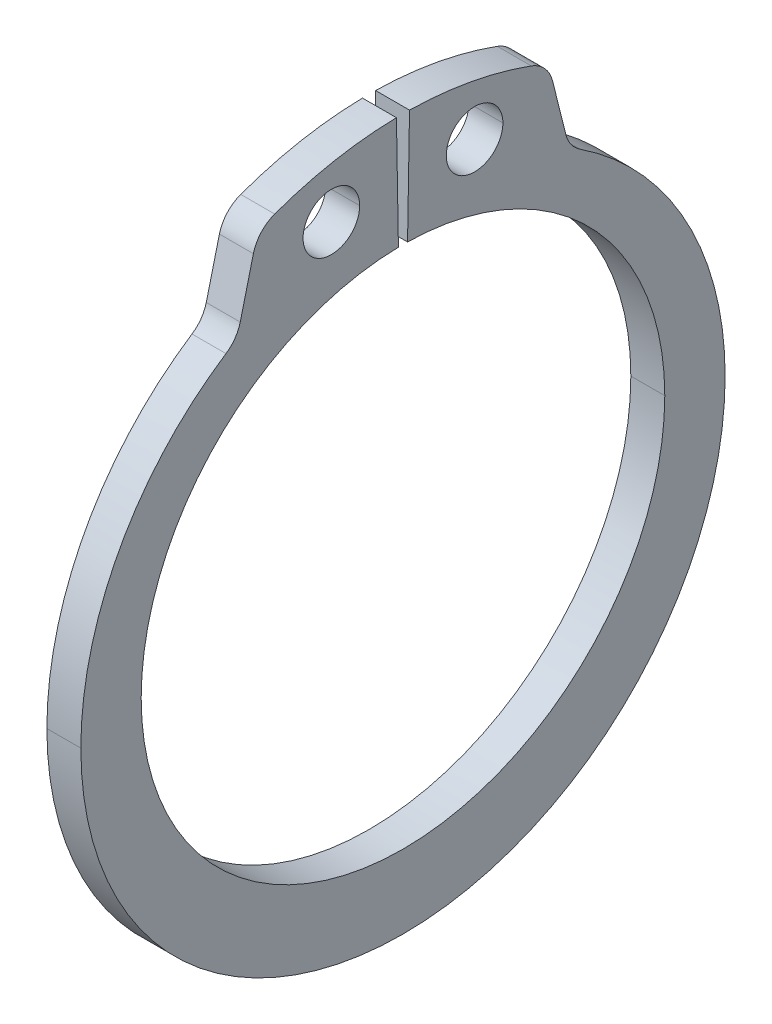
ISO-10303-21;
HEADER;
FILE_DESCRIPTION(('STEP AP214'),'2;1');
FILE_NAME('part.step','',(''),(''),'','','');
FILE_SCHEMA(('AUTOMOTIVE_DESIGN { 1 0 10303 214 1 1 1 1 }'));
ENDSEC;
DATA;
#1=APPLICATION_CONTEXT('core data for automotive mechanical design processes');
#2=APPLICATION_PROTOCOL_DEFINITION('international standard','automotive_design',2000,#1);
#3=PRODUCT_CONTEXT('',#1,'mechanical');
#4=PRODUCT('Part','Part','',(#3));
#5=PRODUCT_RELATED_PRODUCT_CATEGORY('part','',(#4));
#6=PRODUCT_DEFINITION_FORMATION('','',#4);
#7=PRODUCT_DEFINITION_CONTEXT('part definition',#1,'design');
#8=PRODUCT_DEFINITION('design','',#6,#7);
#9=PRODUCT_DEFINITION_SHAPE('','',#8);
#10=(LENGTH_UNIT() NAMED_UNIT(*) SI_UNIT(.MILLI.,.METRE.));
#11=(NAMED_UNIT(*) PLANE_ANGLE_UNIT() SI_UNIT($,.RADIAN.));
#12=(NAMED_UNIT(*) SI_UNIT($,.STERADIAN.) SOLID_ANGLE_UNIT());
#13=UNCERTAINTY_MEASURE_WITH_UNIT(LENGTH_MEASURE(1.E-05),#10,'distance_accuracy_value','');
#14=(GEOMETRIC_REPRESENTATION_CONTEXT(3) GLOBAL_UNCERTAINTY_ASSIGNED_CONTEXT((#13)) GLOBAL_UNIT_ASSIGNED_CONTEXT((#10,
#11,#12)) REPRESENTATION_CONTEXT('',''));
#15=CARTESIAN_POINT('',(0.,0.,0.));
#16=DIRECTION('',(0.,0.,1.));
#17=DIRECTION('',(1.,0.,0.));
#18=AXIS2_PLACEMENT_3D('',#15,#16,#17);
#19=CARTESIAN_POINT('',(0.6,10.0435846721276,-6.91422525299489));
#20=DIRECTION('',(-1.,0.,0.));
#21=DIRECTION('',(0.,0.,1.));
#22=AXIS2_PLACEMENT_3D('',#19,#20,#21);
#23=CYLINDRICAL_SURFACE('',#22,1.2);
#24=CARTESIAN_POINT('',(0.6,10.0435846721276,-6.91422525299489));
#25=DIRECTION('',(-1.,0.,0.));
#26=DIRECTION('',(0.,0.,-1.));
#27=AXIS2_PLACEMENT_3D('',#24,#25,#26);
#28=CIRCLE('',#27,1.2);
#29=CARTESIAN_POINT('',(0.6,9.04102340024933,-6.25477783573576));
#30=VERTEX_POINT('',#29);
#31=CARTESIAN_POINT('',(0.6,9.75327839740805,-5.74987038146369));
#32=VERTEX_POINT('',#31);
#33=EDGE_CURVE('E224',#30,#32,#28,.T.);
#34=ORIENTED_EDGE('',*,*,#33,.F.);
#35=DIRECTION('',(1.,0.,0.));
#36=VECTOR('',#35,1.);
#37=CARTESIAN_POINT('',(0.6,9.04102340024933,-6.25477783573576));
#38=LINE('',#37,#36);
#39=CARTESIAN_POINT('',(-0.6,9.04102340024933,-6.25477783573576));
#40=VERTEX_POINT('',#39);
#41=EDGE_CURVE('E226',#40,#30,#38,.T.);
#42=ORIENTED_EDGE('',*,*,#41,.F.);
#43=CARTESIAN_POINT('',(-0.6,10.0435846721276,-6.91422525299489));
#44=DIRECTION('',(1.,0.,0.));
#45=DIRECTION('',(0.,0.,-1.));
#46=AXIS2_PLACEMENT_3D('',#43,#44,#45);
#47=CIRCLE('',#46,1.2);
#48=CARTESIAN_POINT('',(-0.6,9.75327839740805,-5.74987038146369));
#49=VERTEX_POINT('',#48);
#50=EDGE_CURVE('E247',#49,#40,#47,.T.);
#51=ORIENTED_EDGE('',*,*,#50,.F.);
#52=DIRECTION('',(-1.,0.,0.));
#53=VECTOR('',#52,1.);
#54=CARTESIAN_POINT('',(-0.6,9.75327839740805,-5.74987038146369));
#55=LINE('',#54,#53);
#56=EDGE_CURVE('E254',#32,#49,#55,.T.);
#57=ORIENTED_EDGE('',*,*,#56,.F.);
#58=EDGE_LOOP('',(#34,#42,#51,#57));
#59=FACE_BOUND('',#58,.T.);
#60=ADVANCED_FACE('F16',(#59),#23,.F.);
#61=CARTESIAN_POINT('',(0.6,11.3231592010464,-4.12171878077083));
#62=DIRECTION('',(-1.,0.,0.));
#63=DIRECTION('',(0.,0.,1.));
#64=AXIS2_PLACEMENT_3D('',#61,#62,#63);
#65=CYLINDRICAL_SURFACE('',#64,1.2);
#66=CARTESIAN_POINT('',(0.6,11.3231592010464,-4.12171878077083));
#67=DIRECTION('',(1.,0.,0.));
#68=DIRECTION('',(0.,0.,-1.));
#69=AXIS2_PLACEMENT_3D('',#66,#67,#68);
#70=CIRCLE('',#69,1.2);
#71=CARTESIAN_POINT('',(0.6,11.613465475766,-5.28607365230203));
#72=VERTEX_POINT('',#71);
#73=CARTESIAN_POINT('',(0.6,12.4507767148435,-4.53218040209241));
#74=VERTEX_POINT('',#73);
#75=EDGE_CURVE('E259',#72,#74,#70,.T.);
#76=ORIENTED_EDGE('',*,*,#75,.F.);
#77=DIRECTION('',(1.,0.,0.));
#78=VECTOR('',#77,1.);
#79=CARTESIAN_POINT('',(0.6,11.613465475766,-5.28607365230203));
#80=LINE('',#79,#78);
#81=CARTESIAN_POINT('',(-0.6,11.613465475766,-5.28607365230203));
#82=VERTEX_POINT('',#81);
#83=EDGE_CURVE('E304',#82,#72,#80,.T.);
#84=ORIENTED_EDGE('',*,*,#83,.F.);
#85=CARTESIAN_POINT('',(-0.6,11.3231592010464,-4.12171878077083));
#86=DIRECTION('',(-1.,0.,0.));
#87=DIRECTION('',(0.,0.,-1.));
#88=AXIS2_PLACEMENT_3D('',#85,#86,#87);
#89=CIRCLE('',#88,1.2);
#90=CARTESIAN_POINT('',(-0.6,12.4507767148435,-4.53218040209241));
#91=VERTEX_POINT('',#90);
#92=EDGE_CURVE('E219',#91,#82,#89,.T.);
#93=ORIENTED_EDGE('',*,*,#92,.F.);
#94=DIRECTION('',(-1.,0.,0.));
#95=VECTOR('',#94,1.);
#96=CARTESIAN_POINT('',(0.6,12.4507767148435,-4.53218040209241));
#97=LINE('',#96,#95);
#98=EDGE_CURVE('E27',#74,#91,#97,.T.);
#99=ORIENTED_EDGE('',*,*,#98,.F.);
#100=EDGE_LOOP('',(#76,#84,#93,#99));
#101=FACE_BOUND('',#100,.T.);
#102=ADVANCED_FACE('F629',(#101),#65,.T.);
#103=CARTESIAN_POINT('',(0.6,11.3231592010464,4.12171878077083));
#104=DIRECTION('',(-1.,0.,0.));
#105=DIRECTION('',(0.,0.,1.));
#106=AXIS2_PLACEMENT_3D('',#103,#104,#105);
#107=CYLINDRICAL_SURFACE('',#106,1.2);
#108=CARTESIAN_POINT('',(0.6,11.3231592010464,4.12171878077083));
#109=DIRECTION('',(1.,0.,0.));
#110=DIRECTION('',(0.,0.,-1.));
#111=AXIS2_PLACEMENT_3D('',#108,#109,#110);
#112=CIRCLE('',#111,1.2);
#113=CARTESIAN_POINT('',(0.6,12.4507767148435,4.5321804020924));
#114=VERTEX_POINT('',#113);
#115=CARTESIAN_POINT('',(0.6,11.613465475766,5.28607365230202));
#116=VERTEX_POINT('',#115);
#117=EDGE_CURVE('E296',#114,#116,#112,.T.);
#118=ORIENTED_EDGE('',*,*,#117,.F.);
#119=DIRECTION('',(1.,0.,0.));
#120=VECTOR('',#119,1.);
#121=CARTESIAN_POINT('',(0.6,12.4507767148435,4.5321804020924));
#122=LINE('',#121,#120);
#123=CARTESIAN_POINT('',(-0.6,12.4507767148435,4.5321804020924));
#124=VERTEX_POINT('',#123);
#125=EDGE_CURVE('E310',#124,#114,#122,.T.);
#126=ORIENTED_EDGE('',*,*,#125,.F.);
#127=CARTESIAN_POINT('',(-0.6,11.3231592010464,4.12171878077083));
#128=DIRECTION('',(-1.,0.,0.));
#129=DIRECTION('',(0.,0.,-1.));
#130=AXIS2_PLACEMENT_3D('',#127,#128,#129);
#131=CIRCLE('',#130,1.2);
#132=CARTESIAN_POINT('',(-0.6,11.613465475766,5.28607365230202));
#133=VERTEX_POINT('',#132);
#134=EDGE_CURVE('E209',#133,#124,#131,.T.);
#135=ORIENTED_EDGE('',*,*,#134,.F.);
#136=DIRECTION('',(-1.,0.,0.));
#137=VECTOR('',#136,1.);
#138=CARTESIAN_POINT('',(0.6,11.613465475766,5.28607365230202));
#139=LINE('',#138,#137);
#140=EDGE_CURVE('E309',#116,#133,#139,.T.);
#141=ORIENTED_EDGE('',*,*,#140,.F.);
#142=EDGE_LOOP('',(#118,#126,#135,#141));
#143=FACE_BOUND('',#142,.T.);
#144=ADVANCED_FACE('F18',(#143),#107,.T.);
#145=CARTESIAN_POINT('',(0.6,10.0435846721276,6.91422525299489));
#146=DIRECTION('',(-1.,0.,0.));
#147=DIRECTION('',(0.,0.,1.));
#148=AXIS2_PLACEMENT_3D('',#145,#146,#147);
#149=CYLINDRICAL_SURFACE('',#148,1.2);
#150=CARTESIAN_POINT('',(0.6,10.0435846721276,6.91422525299489));
#151=DIRECTION('',(-1.,0.,0.));
#152=DIRECTION('',(0.,0.,-1.));
#153=AXIS2_PLACEMENT_3D('',#150,#151,#152);
#154=CIRCLE('',#153,1.2);
#155=CARTESIAN_POINT('',(0.6,9.75327839740805,5.74987038146369));
#156=VERTEX_POINT('',#155);
#157=CARTESIAN_POINT('',(0.6,9.04102340024933,6.25477783573576));
#158=VERTEX_POINT('',#157);
#159=EDGE_CURVE('E225',#156,#158,#154,.T.);
#160=ORIENTED_EDGE('',*,*,#159,.F.);
#161=DIRECTION('',(1.,0.,0.));
#162=VECTOR('',#161,1.);
#163=CARTESIAN_POINT('',(0.6,9.75327839740805,5.74987038146369));
#164=LINE('',#163,#162);
#165=CARTESIAN_POINT('',(-0.6,9.75327839740805,5.74987038146369));
#166=VERTEX_POINT('',#165);
#167=EDGE_CURVE('E305',#166,#156,#164,.T.);
#168=ORIENTED_EDGE('',*,*,#167,.F.);
#169=CARTESIAN_POINT('',(-0.6,10.0435846721276,6.91422525299489));
#170=DIRECTION('',(1.,0.,0.));
#171=DIRECTION('',(0.,0.,-1.));
#172=AXIS2_PLACEMENT_3D('',#169,#170,#171);
#173=CIRCLE('',#172,1.2);
#174=CARTESIAN_POINT('',(-0.6,9.04102340024933,6.25477783573576));
#175=VERTEX_POINT('',#174);
#176=EDGE_CURVE('E242',#175,#166,#173,.T.);
#177=ORIENTED_EDGE('',*,*,#176,.F.);
#178=DIRECTION('',(-1.,0.,0.));
#179=VECTOR('',#178,1.);
#180=CARTESIAN_POINT('',(0.6,9.04102340024933,6.25477783573576));
#181=LINE('',#180,#179);
#182=EDGE_CURVE('E42',#158,#175,#181,.T.);
#183=ORIENTED_EDGE('',*,*,#182,.F.);
#184=EDGE_LOOP('',(#160,#168,#177,#183));
#185=FACE_BOUND('',#184,.T.);
#186=ADVANCED_FACE('F832',(#185),#149,.F.);
#187=CARTESIAN_POINT('',(0.6,11.2075498339008,-2.53014564968776));
#188=DIRECTION('',(-1.,0.,0.));
#189=DIRECTION('',(0.,0.,1.));
#190=AXIS2_PLACEMENT_3D('',#187,#188,#189);
#191=CYLINDRICAL_SURFACE('',#190,1.);
#192=DIRECTION('',(-1.,0.,0.));
#193=VECTOR('',#192,1.);
#194=CARTESIAN_POINT('',(0.6,11.2075498339008,-3.53014564968776));
#195=LINE('',#194,#193);
#196=CARTESIAN_POINT('',(0.6,11.2075498339008,-3.53014564968776));
#197=VERTEX_POINT('',#196);
#198=CARTESIAN_POINT('',(-0.6,11.2075498339008,-3.53014564968776));
#199=VERTEX_POINT('',#198);
#200=EDGE_CURVE('E328',#197,#199,#195,.T.);
#201=ORIENTED_EDGE('',*,*,#200,.F.);
#202=CARTESIAN_POINT('',(0.6,11.2075498339008,-2.53014564968776));
#203=DIRECTION('',(1.,0.,0.));
#204=DIRECTION('',(0.,0.,-1.));
#205=AXIS2_PLACEMENT_3D('',#202,#203,#204);
#206=CIRCLE('',#205,1.);
#207=CARTESIAN_POINT('',(0.6,11.2075498339008,-1.53014564968775));
#208=VERTEX_POINT('',#207);
#209=EDGE_CURVE('E211',#197,#208,#206,.T.);
#210=ORIENTED_EDGE('',*,*,#209,.T.);
#211=DIRECTION('',(-1.,0.,0.));
#212=VECTOR('',#211,1.);
#213=CARTESIAN_POINT('',(0.6,11.2075498339008,-1.53014564968775));
#214=LINE('',#213,#212);
#215=CARTESIAN_POINT('',(-0.6,11.2075498339008,-1.53014564968775));
#216=VERTEX_POINT('',#215);
#217=EDGE_CURVE('E273',#208,#216,#214,.T.);
#218=ORIENTED_EDGE('',*,*,#217,.T.);
#219=CARTESIAN_POINT('',(-0.6,11.2075498339008,-2.53014564968776));
#220=DIRECTION('',(1.,0.,0.));
#221=DIRECTION('',(0.,0.,-1.));
#222=AXIS2_PLACEMENT_3D('',#219,#220,#221);
#223=CIRCLE('',#222,1.);
#224=EDGE_CURVE('E241',#199,#216,#223,.T.);
#225=ORIENTED_EDGE('',*,*,#224,.F.);
#226=EDGE_LOOP('',(#201,#210,#218,#225));
#227=FACE_BOUND('',#226,.T.);
#228=ADVANCED_FACE('F828',(#227),#191,.F.);
#229=CARTESIAN_POINT('',(0.6,11.2075498339008,2.53014564968776));
#230=DIRECTION('',(-1.,0.,0.));
#231=DIRECTION('',(0.,0.,1.));
#232=AXIS2_PLACEMENT_3D('',#229,#230,#231);
#233=CYLINDRICAL_SURFACE('',#232,1.);
#234=DIRECTION('',(-1.,0.,0.));
#235=VECTOR('',#234,1.);
#236=CARTESIAN_POINT('',(0.6,11.2075498339008,1.53014564968775));
#237=LINE('',#236,#235);
#238=CARTESIAN_POINT('',(0.6,11.2075498339008,1.53014564968775));
#239=VERTEX_POINT('',#238);
#240=CARTESIAN_POINT('',(-0.6,11.2075498339008,1.53014564968775));
#241=VERTEX_POINT('',#240);
#242=EDGE_CURVE('E232',#239,#241,#237,.T.);
#243=ORIENTED_EDGE('',*,*,#242,.F.);
#244=CARTESIAN_POINT('',(0.6,11.2075498339008,2.53014564968776));
#245=DIRECTION('',(1.,0.,0.));
#246=DIRECTION('',(0.,0.,-1.));
#247=AXIS2_PLACEMENT_3D('',#244,#245,#246);
#248=CIRCLE('',#247,1.);
#249=CARTESIAN_POINT('',(0.6,11.2075498339008,3.53014564968776));
#250=VERTEX_POINT('',#249);
#251=EDGE_CURVE('E214',#239,#250,#248,.T.);
#252=ORIENTED_EDGE('',*,*,#251,.T.);
#253=DIRECTION('',(-1.,0.,0.));
#254=VECTOR('',#253,1.);
#255=CARTESIAN_POINT('',(0.6,11.2075498339008,3.53014564968776));
#256=LINE('',#255,#254);
#257=CARTESIAN_POINT('',(-0.6,11.2075498339008,3.53014564968776));
#258=VERTEX_POINT('',#257);
#259=EDGE_CURVE('E265',#250,#258,#256,.T.);
#260=ORIENTED_EDGE('',*,*,#259,.T.);
#261=CARTESIAN_POINT('',(-0.6,11.2075498339008,2.53014564968776));
#262=DIRECTION('',(1.,0.,0.));
#263=DIRECTION('',(0.,0.,-1.));
#264=AXIS2_PLACEMENT_3D('',#261,#262,#263);
#265=CIRCLE('',#264,1.);
#266=EDGE_CURVE('E238',#241,#258,#265,.T.);
#267=ORIENTED_EDGE('',*,*,#266,.F.);
#268=EDGE_LOOP('',(#243,#252,#260,#267));
#269=FACE_BOUND('',#268,.T.);
#270=ADVANCED_FACE('F606',(#269),#233,.F.);
#271=CARTESIAN_POINT('',(0.6,13.2479819608222,-0.231244385294006));
#272=DIRECTION('',(0.,-0.0174524064372833,-0.999847695156391));
#273=DIRECTION('',(0.,-0.999847695156391,0.0174524064372833));
#274=AXIS2_PLACEMENT_3D('',#271,#272,#273);
#275=PLANE('',#274);
#276=DIRECTION('',(0.,-0.999847695156391,0.0174524064372833));
#277=VECTOR('',#276,1.);
#278=CARTESIAN_POINT('',(-0.6,13.2479819608222,-0.231244385294006));
#279=LINE('',#278,#277);
#280=CARTESIAN_POINT('',(-0.6,13.2479819608222,-0.231244385294006));
#281=VERTEX_POINT('',#280);
#282=CARTESIAN_POINT('',(-0.6,9.24859118019662,-0.161434759544873));
#283=VERTEX_POINT('',#282);
#284=EDGE_CURVE('E180',#281,#283,#279,.T.);
#285=ORIENTED_EDGE('',*,*,#284,.T.);
#286=DIRECTION('',(-1.,0.,0.));
#287=VECTOR('',#286,1.);
#288=CARTESIAN_POINT('',(0.6,9.24859118019662,-0.161434759544873));
#289=LINE('',#288,#287);
#290=CARTESIAN_POINT('',(0.6,9.24859118019662,-0.161434759544873));
#291=VERTEX_POINT('',#290);
#292=EDGE_CURVE('E175',#291,#283,#289,.T.);
#293=ORIENTED_EDGE('',*,*,#292,.F.);
#294=DIRECTION('',(0.,-0.999847695156391,0.0174524064372833));
#295=VECTOR('',#294,1.);
#296=CARTESIAN_POINT('',(0.6,13.2479819608222,-0.231244385294006));
#297=LINE('',#296,#295);
#298=CARTESIAN_POINT('',(0.6,13.2479819608222,-0.231244385294006));
#299=VERTEX_POINT('',#298);
#300=EDGE_CURVE('E264',#299,#291,#297,.T.);
#301=ORIENTED_EDGE('',*,*,#300,.F.);
#302=DIRECTION('',(-1.,0.,0.));
#303=VECTOR('',#302,1.);
#304=CARTESIAN_POINT('',(0.6,13.2479819608222,-0.231244385294006));
#305=LINE('',#304,#303);
#306=EDGE_CURVE('E11',#299,#281,#305,.T.);
#307=ORIENTED_EDGE('',*,*,#306,.T.);
#308=EDGE_LOOP('',(#285,#293,#301,#307));
#309=FACE_BOUND('',#308,.T.);
#310=ADVANCED_FACE('F439',(#309),#275,.F.);
#311=CARTESIAN_POINT('',(0.6,0.,0.));
#312=DIRECTION('',(-1.,0.,0.));
#313=DIRECTION('',(0.,0.,1.));
#314=AXIS2_PLACEMENT_3D('',#311,#312,#313);
#315=CYLINDRICAL_SURFACE('',#314,13.25);
#316=CARTESIAN_POINT('',(0.6,0.,0.));
#317=DIRECTION('',(1.,0.,0.));
#318=DIRECTION('',(0.,0.,1.));
#319=AXIS2_PLACEMENT_3D('',#316,#317,#318);
#320=CIRCLE('',#319,13.25);
#321=EDGE_CURVE('E260',#74,#299,#320,.T.);
#322=ORIENTED_EDGE('',*,*,#321,.F.);
#323=ORIENTED_EDGE('',*,*,#98,.T.);
#324=CARTESIAN_POINT('',(-0.6,0.,0.));
#325=DIRECTION('',(1.,0.,0.));
#326=DIRECTION('',(0.,0.,1.));
#327=AXIS2_PLACEMENT_3D('',#324,#325,#326);
#328=CIRCLE('',#327,13.25);
#329=EDGE_CURVE('E215',#91,#281,#328,.T.);
#330=ORIENTED_EDGE('',*,*,#329,.T.);
#331=ORIENTED_EDGE('',*,*,#306,.F.);
#332=EDGE_LOOP('',(#322,#323,#330,#331));
#333=FACE_BOUND('',#332,.T.);
#334=ADVANCED_FACE('F443',(#333),#315,.T.);
#335=CARTESIAN_POINT('',(0.6,12.2139395720065,-5.13635864512732));
#336=DIRECTION('',(0.,-0.241921895599666,0.970295726275997));
#337=DIRECTION('',(-1.,0.,0.));
#338=AXIS2_PLACEMENT_3D('',#335,#336,#337);
#339=PLANE('',#338);
#340=DIRECTION('',(0.,0.970295726275997,0.241921895599666));
#341=VECTOR('',#340,1.);
#342=CARTESIAN_POINT('',(-0.6,12.2139395720065,-5.13635864512732));
#343=LINE('',#342,#341);
#344=EDGE_CURVE('E243',#49,#82,#343,.T.);
#345=ORIENTED_EDGE('',*,*,#344,.T.);
#346=ORIENTED_EDGE('',*,*,#83,.T.);
#347=DIRECTION('',(0.,0.970295726275997,0.241921895599666));
#348=VECTOR('',#347,1.);
#349=CARTESIAN_POINT('',(0.6,12.2139395720065,-5.13635864512732));
#350=LINE('',#349,#348);
#351=EDGE_CURVE('E255',#32,#72,#350,.T.);
#352=ORIENTED_EDGE('',*,*,#351,.F.);
#353=ORIENTED_EDGE('',*,*,#56,.T.);
#354=EDGE_LOOP('',(#345,#346,#352,#353));
#355=FACE_BOUND('',#354,.T.);
#356=ADVANCED_FACE('F644',(#355),#339,.F.);
#357=CARTESIAN_POINT('',(0.6,-0.468147245038729,0.));
#358=DIRECTION('',(-1.,0.,0.));
#359=DIRECTION('',(0.,0.,1.));
#360=AXIS2_PLACEMENT_3D('',#357,#358,#359);
#361=CYLINDRICAL_SURFACE('',#360,11.3818527549613);
#362=DIRECTION('',(-1.,0.,0.));
#363=VECTOR('',#362,1.);
#364=CARTESIAN_POINT('',(0.6,-0.468147245038729,11.3818527549613));
#365=LINE('',#364,#363);
#366=CARTESIAN_POINT('',(0.6,-0.468147245038729,11.3818527549613));
#367=VERTEX_POINT('',#366);
#368=CARTESIAN_POINT('',(-0.6,-0.468147245038729,11.3818527549613));
#369=VERTEX_POINT('',#368);
#370=EDGE_CURVE('E337',#367,#369,#365,.T.);
#371=ORIENTED_EDGE('',*,*,#370,.F.);
#372=CARTESIAN_POINT('',(0.6,-0.468147245038729,0.));
#373=DIRECTION('',(1.,0.,0.));
#374=DIRECTION('',(0.,0.,-1.));
#375=AXIS2_PLACEMENT_3D('',#372,#373,#374);
#376=CIRCLE('',#375,11.3818527549613);
#377=EDGE_CURVE('E220',#158,#367,#376,.T.);
#378=ORIENTED_EDGE('',*,*,#377,.F.);
#379=ORIENTED_EDGE('',*,*,#182,.T.);
#380=CARTESIAN_POINT('',(-0.6,-0.468147245038729,0.));
#381=DIRECTION('',(1.,0.,0.));
#382=DIRECTION('',(0.,0.,-1.));
#383=AXIS2_PLACEMENT_3D('',#380,#381,#382);
#384=CIRCLE('',#383,11.3818527549613);
#385=EDGE_CURVE('E322',#175,#369,#384,.T.);
#386=ORIENTED_EDGE('',*,*,#385,.T.);
#387=EDGE_LOOP('',(#371,#378,#379,#386));
#388=FACE_BOUND('',#387,.T.);
#389=ADVANCED_FACE('F642',(#388),#361,.T.);
#390=CARTESIAN_POINT('',(0.6,12.2139395720065,5.13635864512731));
#391=DIRECTION('',(0.,-0.241921895599665,-0.970295726275997));
#392=DIRECTION('',(0.,-0.970295726275997,0.241921895599665));
#393=AXIS2_PLACEMENT_3D('',#390,#391,#392);
#394=PLANE('',#393);
#395=DIRECTION('',(0.,-0.970295726275997,0.241921895599665));
#396=VECTOR('',#395,1.);
#397=CARTESIAN_POINT('',(-0.6,12.2139395720065,5.13635864512731));
#398=LINE('',#397,#396);
#399=EDGE_CURVE('E213',#133,#166,#398,.T.);
#400=ORIENTED_EDGE('',*,*,#399,.T.);
#401=ORIENTED_EDGE('',*,*,#167,.T.);
#402=DIRECTION('',(0.,-0.970295726275997,0.241921895599665));
#403=VECTOR('',#402,1.);
#404=CARTESIAN_POINT('',(0.6,12.2139395720065,5.13635864512731));
#405=LINE('',#404,#403);
#406=EDGE_CURVE('E292',#116,#156,#405,.T.);
#407=ORIENTED_EDGE('',*,*,#406,.F.);
#408=ORIENTED_EDGE('',*,*,#140,.T.);
#409=EDGE_LOOP('',(#400,#401,#407,#408));
#410=FACE_BOUND('',#409,.T.);
#411=ADVANCED_FACE('F636',(#410),#394,.F.);
#412=CARTESIAN_POINT('',(0.6,0.,0.));
#413=DIRECTION('',(-1.,0.,0.));
#414=DIRECTION('',(0.,0.,1.));
#415=AXIS2_PLACEMENT_3D('',#412,#413,#414);
#416=CYLINDRICAL_SURFACE('',#415,13.25);
#417=CARTESIAN_POINT('',(-0.6,0.,0.));
#418=DIRECTION('',(1.,0.,0.));
#419=DIRECTION('',(0.,0.,-1.));
#420=AXIS2_PLACEMENT_3D('',#417,#418,#419);
#421=CIRCLE('',#420,13.25);
#422=CARTESIAN_POINT('',(-0.6,13.2479819608222,0.231244385294007));
#423=VERTEX_POINT('',#422);
#424=EDGE_CURVE('E281',#423,#124,#421,.T.);
#425=ORIENTED_EDGE('',*,*,#424,.T.);
#426=ORIENTED_EDGE('',*,*,#125,.T.);
#427=CARTESIAN_POINT('',(0.6,0.,0.));
#428=DIRECTION('',(1.,0.,0.));
#429=DIRECTION('',(0.,0.,-1.));
#430=AXIS2_PLACEMENT_3D('',#427,#428,#429);
#431=CIRCLE('',#430,13.25);
#432=CARTESIAN_POINT('',(0.6,13.2479819608222,0.231244385294007));
#433=VERTEX_POINT('',#432);
#434=EDGE_CURVE('E353',#433,#114,#431,.T.);
#435=ORIENTED_EDGE('',*,*,#434,.F.);
#436=DIRECTION('',(-1.,0.,0.));
#437=VECTOR('',#436,1.);
#438=CARTESIAN_POINT('',(0.6,13.2479819608222,0.231244385294007));
#439=LINE('',#438,#437);
#440=EDGE_CURVE('E325',#433,#423,#439,.T.);
#441=ORIENTED_EDGE('',*,*,#440,.T.);
#442=EDGE_LOOP('',(#425,#426,#435,#441));
#443=FACE_BOUND('',#442,.T.);
#444=ADVANCED_FACE('F419',(#443),#416,.T.);
#445=CARTESIAN_POINT('',(0.6,9.24859118019662,0.161434759544873));
#446=DIRECTION('',(0.,-0.0174524064372835,0.999847695156391));
#447=DIRECTION('',(-1.,0.,0.));
#448=AXIS2_PLACEMENT_3D('',#445,#446,#447);
#449=PLANE('',#448);
#450=DIRECTION('',(0.,0.999847695156391,0.0174524064372835));
#451=VECTOR('',#450,1.);
#452=CARTESIAN_POINT('',(-0.6,9.24859118019662,0.161434759544873));
#453=LINE('',#452,#451);
#454=CARTESIAN_POINT('',(-0.6,9.24859118019662,0.161434759544873));
#455=VERTEX_POINT('',#454);
#456=EDGE_CURVE('E181',#455,#423,#453,.T.);
#457=ORIENTED_EDGE('',*,*,#456,.T.);
#458=ORIENTED_EDGE('',*,*,#440,.F.);
#459=DIRECTION('',(0.,0.999847695156391,0.0174524064372835));
#460=VECTOR('',#459,1.);
#461=CARTESIAN_POINT('',(0.6,9.24859118019662,0.161434759544873));
#462=LINE('',#461,#460);
#463=CARTESIAN_POINT('',(0.6,9.24859118019662,0.161434759544873));
#464=VERTEX_POINT('',#463);
#465=EDGE_CURVE('E251',#464,#433,#462,.T.);
#466=ORIENTED_EDGE('',*,*,#465,.F.);
#467=DIRECTION('',(-1.,0.,0.));
#468=VECTOR('',#467,1.);
#469=CARTESIAN_POINT('',(0.6,9.24859118019662,0.161434759544873));
#470=LINE('',#469,#468);
#471=EDGE_CURVE('E360',#464,#455,#470,.T.);
#472=ORIENTED_EDGE('',*,*,#471,.T.);
#473=EDGE_LOOP('',(#457,#458,#466,#472));
#474=FACE_BOUND('',#473,.T.);
#475=ADVANCED_FACE('F855',(#474),#449,.F.);
#476=CARTESIAN_POINT('',(0.6,0.,0.));
#477=DIRECTION('',(-1.,0.,0.));
#478=DIRECTION('',(0.,0.,1.));
#479=AXIS2_PLACEMENT_3D('',#476,#477,#478);
#480=CYLINDRICAL_SURFACE('',#479,9.25);
#481=DIRECTION('',(-1.,0.,0.));
#482=VECTOR('',#481,1.);
#483=CARTESIAN_POINT('',(0.6,0.,-9.25));
#484=LINE('',#483,#482);
#485=CARTESIAN_POINT('',(0.6,0.,-9.25));
#486=VERTEX_POINT('',#485);
#487=CARTESIAN_POINT('',(-0.6,0.,-9.25));
#488=VERTEX_POINT('',#487);
#489=EDGE_CURVE('E172',#486,#488,#484,.T.);
#490=ORIENTED_EDGE('',*,*,#489,.F.);
#491=CARTESIAN_POINT('',(0.6,0.,0.));
#492=DIRECTION('',(-1.,0.,0.));
#493=DIRECTION('',(0.,0.,-1.));
#494=AXIS2_PLACEMENT_3D('',#491,#492,#493);
#495=CIRCLE('',#494,9.25);
#496=EDGE_CURVE('E270',#291,#486,#495,.T.);
#497=ORIENTED_EDGE('',*,*,#496,.F.);
#498=ORIENTED_EDGE('',*,*,#292,.T.);
#499=CARTESIAN_POINT('',(-0.6,0.,0.));
#500=DIRECTION('',(-1.,0.,0.));
#501=DIRECTION('',(0.,0.,-1.));
#502=AXIS2_PLACEMENT_3D('',#499,#500,#501);
#503=CIRCLE('',#502,9.25);
#504=EDGE_CURVE('E167',#283,#488,#503,.T.);
#505=ORIENTED_EDGE('',*,*,#504,.T.);
#506=EDGE_LOOP('',(#490,#497,#498,#505));
#507=FACE_BOUND('',#506,.T.);
#508=ADVANCED_FACE('F169',(#507),#480,.F.);
#509=CARTESIAN_POINT('',(-0.6,0.,0.));
#510=DIRECTION('',(1.,0.,0.));
#511=DIRECTION('',(0.,1.,0.));
#512=AXIS2_PLACEMENT_3D('',#509,#510,#511);
#513=PLANE('',#512);
#514=CARTESIAN_POINT('',(-0.6,11.2075498339008,-2.53014564968776));
#515=DIRECTION('',(1.,0.,0.));
#516=DIRECTION('',(0.,0.,-1.));
#517=AXIS2_PLACEMENT_3D('',#514,#515,#516);
#518=CIRCLE('',#517,1.);
#519=EDGE_CURVE('E277',#216,#199,#518,.T.);
#520=ORIENTED_EDGE('',*,*,#519,.T.);
#521=ORIENTED_EDGE('',*,*,#224,.T.);
#522=EDGE_LOOP('',(#520,#521));
#523=FACE_BOUND('',#522,.T.);
#524=CARTESIAN_POINT('',(-0.6,11.2075498339008,2.53014564968776));
#525=DIRECTION('',(1.,0.,0.));
#526=DIRECTION('',(0.,0.,-1.));
#527=AXIS2_PLACEMENT_3D('',#524,#525,#526);
#528=CIRCLE('',#527,1.);
#529=EDGE_CURVE('E235',#258,#241,#528,.T.);
#530=ORIENTED_EDGE('',*,*,#529,.T.);
#531=ORIENTED_EDGE('',*,*,#266,.T.);
#532=EDGE_LOOP('',(#530,#531));
#533=FACE_BOUND('',#532,.T.);
#534=ORIENTED_EDGE('',*,*,#399,.F.);
#535=ORIENTED_EDGE('',*,*,#134,.T.);
#536=ORIENTED_EDGE('',*,*,#424,.F.);
#537=ORIENTED_EDGE('',*,*,#456,.F.);
#538=CARTESIAN_POINT('',(-0.6,0.,0.));
#539=DIRECTION('',(-1.,0.,0.));
#540=DIRECTION('',(0.,0.,-1.));
#541=AXIS2_PLACEMENT_3D('',#538,#539,#540);
#542=CIRCLE('',#541,9.25);
#543=CARTESIAN_POINT('',(-0.6,0.,9.25));
#544=VERTEX_POINT('',#543);
#545=EDGE_CURVE('E188',#544,#455,#542,.T.);
#546=ORIENTED_EDGE('',*,*,#545,.F.);
#547=CARTESIAN_POINT('',(-0.6,0.,0.));
#548=DIRECTION('',(-1.,0.,0.));
#549=DIRECTION('',(0.,0.,-1.));
#550=AXIS2_PLACEMENT_3D('',#547,#548,#549);
#551=CIRCLE('',#550,9.25);
#552=EDGE_CURVE('E184',#488,#544,#551,.T.);
#553=ORIENTED_EDGE('',*,*,#552,.F.);
#554=ORIENTED_EDGE('',*,*,#504,.F.);
#555=ORIENTED_EDGE('',*,*,#284,.F.);
#556=ORIENTED_EDGE('',*,*,#329,.F.);
#557=ORIENTED_EDGE('',*,*,#92,.T.);
#558=ORIENTED_EDGE('',*,*,#344,.F.);
#559=ORIENTED_EDGE('',*,*,#50,.T.);
#560=CARTESIAN_POINT('',(-0.6,-0.468147245038729,0.));
#561=DIRECTION('',(1.,0.,0.));
#562=DIRECTION('',(0.,0.,-1.));
#563=AXIS2_PLACEMENT_3D('',#560,#561,#562);
#564=CIRCLE('',#563,11.3818527549613);
#565=CARTESIAN_POINT('',(-0.6,-0.468147245038727,-11.3818527549613));
#566=VERTEX_POINT('',#565);
#567=EDGE_CURVE('E231',#566,#40,#564,.T.);
#568=ORIENTED_EDGE('',*,*,#567,.F.);
#569=CARTESIAN_POINT('',(-0.6,-0.468147245038729,0.));
#570=DIRECTION('',(1.,0.,0.));
#571=DIRECTION('',(0.,0.,-1.));
#572=AXIS2_PLACEMENT_3D('',#569,#570,#571);
#573=CIRCLE('',#572,11.3818527549613);
#574=EDGE_CURVE('E205',#369,#566,#573,.T.);
#575=ORIENTED_EDGE('',*,*,#574,.F.);
#576=ORIENTED_EDGE('',*,*,#385,.F.);
#577=ORIENTED_EDGE('',*,*,#176,.T.);
#578=EDGE_LOOP('',(#534,#535,#536,#537,#546,#553,#554,#555,#556,#557,#558,#559,#568,#575,#576,#577));
#579=FACE_BOUND('',#578,.T.);
#580=ADVANCED_FACE('F186',(#523,#533,#579),#513,.F.);
#581=CARTESIAN_POINT('',(0.6,0.,0.));
#582=DIRECTION('',(1.,0.,0.));
#583=DIRECTION('',(0.,1.,0.));
#584=AXIS2_PLACEMENT_3D('',#581,#582,#583);
#585=PLANE('',#584);
#586=CARTESIAN_POINT('',(0.6,11.2075498339008,-2.53014564968776));
#587=DIRECTION('',(1.,0.,0.));
#588=DIRECTION('',(0.,0.,-1.));
#589=AXIS2_PLACEMENT_3D('',#586,#587,#588);
#590=CIRCLE('',#589,1.);
#591=EDGE_CURVE('E332',#208,#197,#590,.T.);
#592=ORIENTED_EDGE('',*,*,#591,.F.);
#593=ORIENTED_EDGE('',*,*,#209,.F.);
#594=EDGE_LOOP('',(#592,#593));
#595=FACE_BOUND('',#594,.T.);
#596=CARTESIAN_POINT('',(0.6,11.2075498339008,2.53014564968776));
#597=DIRECTION('',(1.,0.,0.));
#598=DIRECTION('',(0.,0.,-1.));
#599=AXIS2_PLACEMENT_3D('',#596,#597,#598);
#600=CIRCLE('',#599,1.);
#601=EDGE_CURVE('E236',#250,#239,#600,.T.);
#602=ORIENTED_EDGE('',*,*,#601,.F.);
#603=ORIENTED_EDGE('',*,*,#251,.F.);
#604=EDGE_LOOP('',(#602,#603));
#605=FACE_BOUND('',#604,.T.);
#606=ORIENTED_EDGE('',*,*,#434,.T.);
#607=ORIENTED_EDGE('',*,*,#117,.T.);
#608=ORIENTED_EDGE('',*,*,#406,.T.);
#609=ORIENTED_EDGE('',*,*,#159,.T.);
#610=ORIENTED_EDGE('',*,*,#377,.T.);
#611=CARTESIAN_POINT('',(0.6,-0.468147245038729,0.));
#612=DIRECTION('',(1.,0.,0.));
#613=DIRECTION('',(0.,0.,-1.));
#614=AXIS2_PLACEMENT_3D('',#611,#612,#613);
#615=CIRCLE('',#614,11.3818527549613);
#616=CARTESIAN_POINT('',(0.6,-0.468147245038727,-11.3818527549613));
#617=VERTEX_POINT('',#616);
#618=EDGE_CURVE('E230',#367,#617,#615,.T.);
#619=ORIENTED_EDGE('',*,*,#618,.T.);
#620=CARTESIAN_POINT('',(0.6,-0.468147245038729,0.));
#621=DIRECTION('',(1.,0.,0.));
#622=DIRECTION('',(0.,0.,-1.));
#623=AXIS2_PLACEMENT_3D('',#620,#621,#622);
#624=CIRCLE('',#623,11.3818527549613);
#625=EDGE_CURVE('E269',#617,#30,#624,.T.);
#626=ORIENTED_EDGE('',*,*,#625,.T.);
#627=ORIENTED_EDGE('',*,*,#33,.T.);
#628=ORIENTED_EDGE('',*,*,#351,.T.);
#629=ORIENTED_EDGE('',*,*,#75,.T.);
#630=ORIENTED_EDGE('',*,*,#321,.T.);
#631=ORIENTED_EDGE('',*,*,#300,.T.);
#632=ORIENTED_EDGE('',*,*,#496,.T.);
#633=CARTESIAN_POINT('',(0.6,0.,0.));
#634=DIRECTION('',(-1.,0.,0.));
#635=DIRECTION('',(0.,0.,-1.));
#636=AXIS2_PLACEMENT_3D('',#633,#634,#635);
#637=CIRCLE('',#636,9.25);
#638=CARTESIAN_POINT('',(0.6,0.,9.25));
#639=VERTEX_POINT('',#638);
#640=EDGE_CURVE('E197',#486,#639,#637,.T.);
#641=ORIENTED_EDGE('',*,*,#640,.T.);
#642=CARTESIAN_POINT('',(0.6,0.,0.));
#643=DIRECTION('',(-1.,0.,0.));
#644=DIRECTION('',(0.,0.,-1.));
#645=AXIS2_PLACEMENT_3D('',#642,#643,#644);
#646=CIRCLE('',#645,9.25);
#647=EDGE_CURVE('E20',#639,#464,#646,.T.);
#648=ORIENTED_EDGE('',*,*,#647,.T.);
#649=ORIENTED_EDGE('',*,*,#465,.T.);
#650=EDGE_LOOP('',(#606,#607,#608,#609,#610,#619,#626,#627,#628,#629,#630,#631,#632,#641,#648,#649));
#651=FACE_BOUND('',#650,.T.);
#652=ADVANCED_FACE('F415',(#595,#605,#651),#585,.T.);
#653=CARTESIAN_POINT('',(0.6,0.,0.));
#654=DIRECTION('',(-1.,0.,0.));
#655=DIRECTION('',(0.,0.,1.));
#656=AXIS2_PLACEMENT_3D('',#653,#654,#655);
#657=CYLINDRICAL_SURFACE('',#656,9.25);
#658=ORIENTED_EDGE('',*,*,#647,.F.);
#659=DIRECTION('',(-1.,0.,0.));
#660=VECTOR('',#659,1.);
#661=CARTESIAN_POINT('',(0.6,0.,9.25));
#662=LINE('',#661,#660);
#663=EDGE_CURVE('E193',#639,#544,#662,.T.);
#664=ORIENTED_EDGE('',*,*,#663,.T.);
#665=ORIENTED_EDGE('',*,*,#545,.T.);
#666=ORIENTED_EDGE('',*,*,#471,.F.);
#667=EDGE_LOOP('',(#658,#664,#665,#666));
#668=FACE_BOUND('',#667,.T.);
#669=ADVANCED_FACE('F613',(#668),#657,.F.);
#670=CARTESIAN_POINT('',(0.6,0.,0.));
#671=DIRECTION('',(-1.,0.,0.));
#672=DIRECTION('',(0.,0.,1.));
#673=AXIS2_PLACEMENT_3D('',#670,#671,#672);
#674=CYLINDRICAL_SURFACE('',#673,9.25);
#675=ORIENTED_EDGE('',*,*,#640,.F.);
#676=ORIENTED_EDGE('',*,*,#489,.T.);
#677=ORIENTED_EDGE('',*,*,#552,.T.);
#678=ORIENTED_EDGE('',*,*,#663,.F.);
#679=EDGE_LOOP('',(#675,#676,#677,#678));
#680=FACE_BOUND('',#679,.T.);
#681=ADVANCED_FACE('F195',(#680),#674,.F.);
#682=CARTESIAN_POINT('',(0.6,-0.468147245038729,0.));
#683=DIRECTION('',(-1.,0.,0.));
#684=DIRECTION('',(0.,0.,1.));
#685=AXIS2_PLACEMENT_3D('',#682,#683,#684);
#686=CYLINDRICAL_SURFACE('',#685,11.3818527549613);
#687=DIRECTION('',(-1.,0.,0.));
#688=VECTOR('',#687,1.);
#689=CARTESIAN_POINT('',(0.6,-0.468147245038727,-11.3818527549613));
#690=LINE('',#689,#688);
#691=EDGE_CURVE('E285',#617,#566,#690,.T.);
#692=ORIENTED_EDGE('',*,*,#691,.F.);
#693=ORIENTED_EDGE('',*,*,#618,.F.);
#694=ORIENTED_EDGE('',*,*,#370,.T.);
#695=ORIENTED_EDGE('',*,*,#574,.T.);
#696=EDGE_LOOP('',(#692,#693,#694,#695));
#697=FACE_BOUND('',#696,.T.);
#698=ADVANCED_FACE('F373',(#697),#686,.T.);
#699=CARTESIAN_POINT('',(0.6,-0.468147245038729,0.));
#700=DIRECTION('',(-1.,0.,0.));
#701=DIRECTION('',(0.,0.,1.));
#702=AXIS2_PLACEMENT_3D('',#699,#700,#701);
#703=CYLINDRICAL_SURFACE('',#702,11.3818527549613);
#704=ORIENTED_EDGE('',*,*,#625,.F.);
#705=ORIENTED_EDGE('',*,*,#691,.T.);
#706=ORIENTED_EDGE('',*,*,#567,.T.);
#707=ORIENTED_EDGE('',*,*,#41,.T.);
#708=EDGE_LOOP('',(#704,#705,#706,#707));
#709=FACE_BOUND('',#708,.T.);
#710=ADVANCED_FACE('F383',(#709),#703,.T.);
#711=CARTESIAN_POINT('',(0.6,11.2075498339008,2.53014564968776));
#712=DIRECTION('',(-1.,0.,0.));
#713=DIRECTION('',(0.,0.,1.));
#714=AXIS2_PLACEMENT_3D('',#711,#712,#713);
#715=CYLINDRICAL_SURFACE('',#714,1.);
#716=ORIENTED_EDGE('',*,*,#601,.T.);
#717=ORIENTED_EDGE('',*,*,#242,.T.);
#718=ORIENTED_EDGE('',*,*,#529,.F.);
#719=ORIENTED_EDGE('',*,*,#259,.F.);
#720=EDGE_LOOP('',(#716,#717,#718,#719));
#721=FACE_BOUND('',#720,.T.);
#722=ADVANCED_FACE('F611',(#721),#715,.F.);
#723=CARTESIAN_POINT('',(0.6,11.2075498339008,-2.53014564968776));
#724=DIRECTION('',(-1.,0.,0.));
#725=DIRECTION('',(0.,0.,1.));
#726=AXIS2_PLACEMENT_3D('',#723,#724,#725);
#727=CYLINDRICAL_SURFACE('',#726,1.);
#728=ORIENTED_EDGE('',*,*,#591,.T.);
#729=ORIENTED_EDGE('',*,*,#200,.T.);
#730=ORIENTED_EDGE('',*,*,#519,.F.);
#731=ORIENTED_EDGE('',*,*,#217,.F.);
#732=EDGE_LOOP('',(#728,#729,#730,#731));
#733=FACE_BOUND('',#732,.T.);
#734=ADVANCED_FACE('F641',(#733),#727,.F.);
#735=CLOSED_SHELL('',(#60,#102,#144,#186,#228,#270,#310,#334,#356,#389,#411,#444,#475,#508,#580,
#652,#669,#681,#698,#710,#722,#734));
#736=MANIFOLD_SOLID_BREP('B1',#735);
#737=ADVANCED_BREP_SHAPE_REPRESENTATION('',(#18,#736),#14);
#738=SHAPE_DEFINITION_REPRESENTATION(#9,#737);
ENDSEC;
END-ISO-10303-21;
